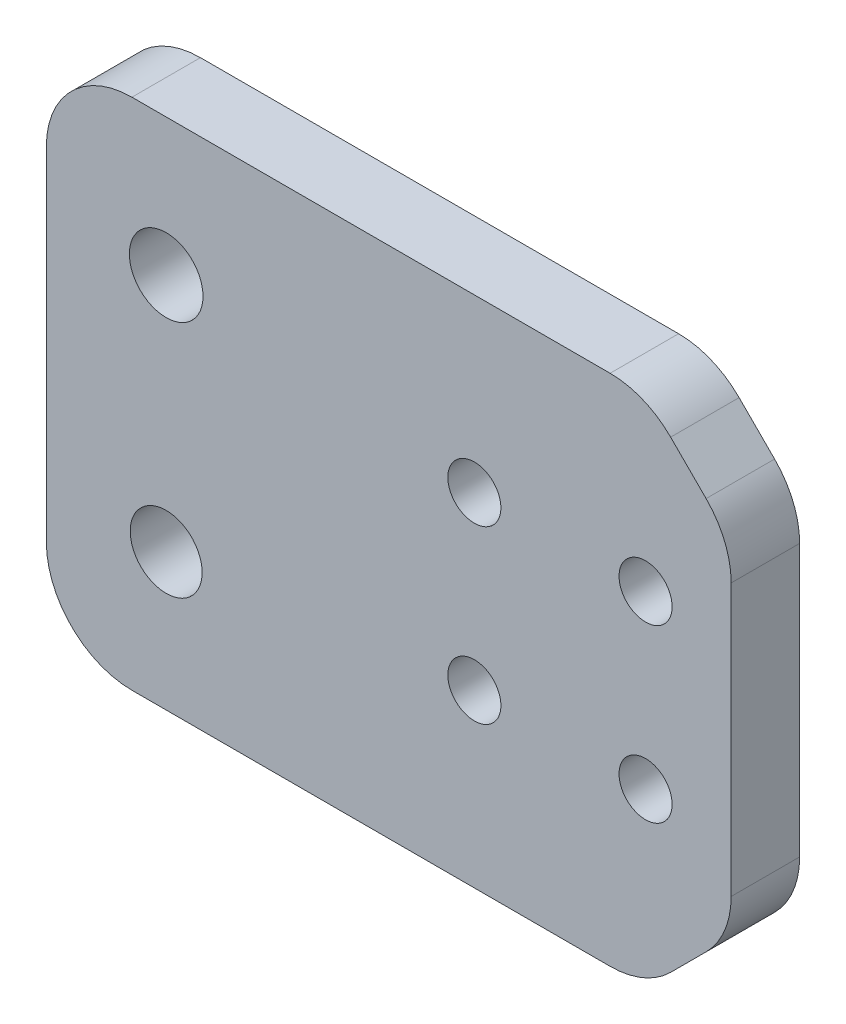
ISO-10303-21;
HEADER;
FILE_DESCRIPTION(('STEP AP214'),'2;1');
FILE_NAME('part.step','',(''),(''),'','','');
FILE_SCHEMA(('AUTOMOTIVE_DESIGN { 1 0 10303 214 1 1 1 1 }'));
ENDSEC;
DATA;
#1=APPLICATION_CONTEXT('core data for automotive mechanical design processes');
#2=APPLICATION_PROTOCOL_DEFINITION('international standard','automotive_design',2000,#1);
#3=PRODUCT_CONTEXT('',#1,'mechanical');
#4=PRODUCT('Part','Part','',(#3));
#5=PRODUCT_RELATED_PRODUCT_CATEGORY('part','',(#4));
#6=PRODUCT_DEFINITION_FORMATION('','',#4);
#7=PRODUCT_DEFINITION_CONTEXT('part definition',#1,'design');
#8=PRODUCT_DEFINITION('design','',#6,#7);
#9=PRODUCT_DEFINITION_SHAPE('','',#8);
#10=(LENGTH_UNIT() NAMED_UNIT(*) SI_UNIT(.MILLI.,.METRE.));
#11=(NAMED_UNIT(*) PLANE_ANGLE_UNIT() SI_UNIT($,.RADIAN.));
#12=(NAMED_UNIT(*) SI_UNIT($,.STERADIAN.) SOLID_ANGLE_UNIT());
#13=UNCERTAINTY_MEASURE_WITH_UNIT(LENGTH_MEASURE(1.E-05),#10,'distance_accuracy_value','');
#14=(GEOMETRIC_REPRESENTATION_CONTEXT(3) GLOBAL_UNCERTAINTY_ASSIGNED_CONTEXT((#13)) GLOBAL_UNIT_ASSIGNED_CONTEXT((#10,
#11,#12)) REPRESENTATION_CONTEXT('',''));
#15=CARTESIAN_POINT('',(0.,0.,0.));
#16=DIRECTION('',(0.,0.,1.));
#17=DIRECTION('',(1.,0.,0.));
#18=AXIS2_PLACEMENT_3D('',#15,#16,#17);
#19=CARTESIAN_POINT('',(0.,0.,4.));
#20=DIRECTION('',(0.,0.,-1.));
#21=DIRECTION('',(-1.,0.,0.));
#22=AXIS2_PLACEMENT_3D('',#19,#20,#21);
#23=PLANE('',#22);
#24=DIRECTION('',(1.,0.,0.));
#25=VECTOR('',#24,1.);
#26=CARTESIAN_POINT('',(0.,0.,4.));
#27=LINE('',#26,#25);
#28=CARTESIAN_POINT('',(5.,0.,4.));
#29=VERTEX_POINT('',#28);
#30=CARTESIAN_POINT('',(32.9289321881345,0.,4.));
#31=VERTEX_POINT('',#30);
#32=EDGE_CURVE('E150',#29,#31,#27,.T.);
#33=ORIENTED_EDGE('',*,*,#32,.T.);
#34=CARTESIAN_POINT('',(32.9289321881345,5.,4.));
#35=DIRECTION('',(0.,0.,-1.));
#36=DIRECTION('',(-1.,0.,0.));
#37=AXIS2_PLACEMENT_3D('',#34,#35,#36);
#38=CIRCLE('',#37,5.);
#39=CARTESIAN_POINT('',(36.4644660940672,1.46446609406726,4.));
#40=VERTEX_POINT('',#39);
#41=EDGE_CURVE('E193',#31,#40,#38,.F.);
#42=ORIENTED_EDGE('',*,*,#41,.T.);
#43=DIRECTION('',(-0.707106781186549,-0.707106781186547,0.));
#44=VECTOR('',#43,1.);
#45=CARTESIAN_POINT('',(40.,5.,4.));
#46=LINE('',#45,#44);
#47=CARTESIAN_POINT('',(38.5355339059327,3.53553390593274,4.));
#48=VERTEX_POINT('',#47);
#49=EDGE_CURVE('E152',#40,#48,#46,.F.);
#50=ORIENTED_EDGE('',*,*,#49,.T.);
#51=CARTESIAN_POINT('',(35.,7.07106781186549,4.));
#52=DIRECTION('',(0.,0.,-1.));
#53=DIRECTION('',(-1.,0.,0.));
#54=AXIS2_PLACEMENT_3D('',#51,#52,#53);
#55=CIRCLE('',#54,5.);
#56=CARTESIAN_POINT('',(40.,7.07106781186549,4.));
#57=VERTEX_POINT('',#56);
#58=EDGE_CURVE('E191',#48,#57,#55,.F.);
#59=ORIENTED_EDGE('',*,*,#58,.T.);
#60=DIRECTION('',(0.,1.,0.));
#61=VECTOR('',#60,1.);
#62=CARTESIAN_POINT('',(40.,0.,4.));
#63=LINE('',#62,#61);
#64=CARTESIAN_POINT('',(40.,22.9289321881345,4.));
#65=VERTEX_POINT('',#64);
#66=EDGE_CURVE('E236',#57,#65,#63,.T.);
#67=ORIENTED_EDGE('',*,*,#66,.T.);
#68=CARTESIAN_POINT('',(35.,22.9289321881345,4.));
#69=DIRECTION('',(0.,0.,-1.));
#70=DIRECTION('',(-1.,0.,0.));
#71=AXIS2_PLACEMENT_3D('',#68,#69,#70);
#72=CIRCLE('',#71,5.);
#73=CARTESIAN_POINT('',(38.5355339059328,26.4644660940672,4.));
#74=VERTEX_POINT('',#73);
#75=EDGE_CURVE('E189',#65,#74,#72,.F.);
#76=ORIENTED_EDGE('',*,*,#75,.T.);
#77=DIRECTION('',(0.707106781186546,-0.70710678118655,0.));
#78=VECTOR('',#77,1.);
#79=CARTESIAN_POINT('',(35.,30.,4.));
#80=LINE('',#79,#78);
#81=CARTESIAN_POINT('',(36.4644660940673,28.5355339059327,4.));
#82=VERTEX_POINT('',#81);
#83=EDGE_CURVE('E177',#74,#82,#80,.F.);
#84=ORIENTED_EDGE('',*,*,#83,.T.);
#85=CARTESIAN_POINT('',(32.9289321881345,25.,4.));
#86=DIRECTION('',(0.,0.,-1.));
#87=DIRECTION('',(-1.,0.,0.));
#88=AXIS2_PLACEMENT_3D('',#85,#86,#87);
#89=CIRCLE('',#88,5.);
#90=CARTESIAN_POINT('',(32.9289321881345,30.,4.));
#91=VERTEX_POINT('',#90);
#92=EDGE_CURVE('E187',#82,#91,#89,.F.);
#93=ORIENTED_EDGE('',*,*,#92,.T.);
#94=DIRECTION('',(-1.,0.,0.));
#95=VECTOR('',#94,1.);
#96=CARTESIAN_POINT('',(0.,30.,4.));
#97=LINE('',#96,#95);
#98=CARTESIAN_POINT('',(5.,30.,4.));
#99=VERTEX_POINT('',#98);
#100=EDGE_CURVE('E175',#91,#99,#97,.T.);
#101=ORIENTED_EDGE('',*,*,#100,.T.);
#102=CARTESIAN_POINT('',(5.,25.,4.));
#103=DIRECTION('',(0.,0.,-1.));
#104=DIRECTION('',(-1.,0.,0.));
#105=AXIS2_PLACEMENT_3D('',#102,#103,#104);
#106=CIRCLE('',#105,5.);
#107=CARTESIAN_POINT('',(0.,25.,4.));
#108=VERTEX_POINT('',#107);
#109=EDGE_CURVE('E183',#99,#108,#106,.F.);
#110=ORIENTED_EDGE('',*,*,#109,.T.);
#111=DIRECTION('',(0.,-1.,0.));
#112=VECTOR('',#111,1.);
#113=CARTESIAN_POINT('',(0.,0.,4.));
#114=LINE('',#113,#112);
#115=CARTESIAN_POINT('',(0.,5.,4.));
#116=VERTEX_POINT('',#115);
#117=EDGE_CURVE('E171',#108,#116,#114,.T.);
#118=ORIENTED_EDGE('',*,*,#117,.T.);
#119=CARTESIAN_POINT('',(5.,5.,4.));
#120=DIRECTION('',(0.,0.,-1.));
#121=DIRECTION('',(-1.,0.,0.));
#122=AXIS2_PLACEMENT_3D('',#119,#120,#121);
#123=CIRCLE('',#122,5.);
#124=EDGE_CURVE('E185',#116,#29,#123,.F.);
#125=ORIENTED_EDGE('',*,*,#124,.T.);
#126=EDGE_LOOP('',(#33,#42,#50,#59,#67,#76,#84,#93,#101,#110,#118,#125));
#127=FACE_BOUND('',#126,.T.);
#128=CARTESIAN_POINT('',(7.,22.,4.));
#129=DIRECTION('',(0.,0.,1.));
#130=DIRECTION('',(1.,0.,0.));
#131=AXIS2_PLACEMENT_3D('',#128,#129,#130);
#132=CIRCLE('',#131,2.14999999999999);
#133=CARTESIAN_POINT('',(9.14999999999999,22.,4.));
#134=VERTEX_POINT('',#133);
#135=EDGE_CURVE('E165',#134,#134,#132,.T.);
#136=ORIENTED_EDGE('',*,*,#135,.F.);
#137=EDGE_LOOP('',(#136));
#138=FACE_BOUND('',#137,.T.);
#139=CARTESIAN_POINT('',(7.,8.00000000000005,4.));
#140=DIRECTION('',(0.,0.,1.));
#141=DIRECTION('',(1.,0.,0.));
#142=AXIS2_PLACEMENT_3D('',#139,#140,#141);
#143=CIRCLE('',#142,2.09999999999999);
#144=CARTESIAN_POINT('',(9.09999999999999,8.00000000000005,4.));
#145=VERTEX_POINT('',#144);
#146=EDGE_CURVE('E245',#145,#145,#143,.T.);
#147=ORIENTED_EDGE('',*,*,#146,.F.);
#148=EDGE_LOOP('',(#147));
#149=FACE_BOUND('',#148,.T.);
#150=CARTESIAN_POINT('',(35.,20.,4.));
#151=DIRECTION('',(0.,0.,1.));
#152=DIRECTION('',(1.,0.,0.));
#153=AXIS2_PLACEMENT_3D('',#150,#151,#152);
#154=CIRCLE('',#153,1.54999999999999);
#155=CARTESIAN_POINT('',(36.55,20.,4.));
#156=VERTEX_POINT('',#155);
#157=EDGE_CURVE('E251',#156,#156,#154,.T.);
#158=ORIENTED_EDGE('',*,*,#157,.F.);
#159=EDGE_LOOP('',(#158));
#160=FACE_BOUND('',#159,.T.);
#161=CARTESIAN_POINT('',(25.,19.9999999999999,4.));
#162=DIRECTION('',(0.,0.,1.));
#163=DIRECTION('',(1.,0.,0.));
#164=AXIS2_PLACEMENT_3D('',#161,#162,#163);
#165=CIRCLE('',#164,1.54999999999999);
#166=CARTESIAN_POINT('',(26.55,19.9999999999999,4.));
#167=VERTEX_POINT('',#166);
#168=EDGE_CURVE('E257',#167,#167,#165,.T.);
#169=ORIENTED_EDGE('',*,*,#168,.F.);
#170=EDGE_LOOP('',(#169));
#171=FACE_BOUND('',#170,.T.);
#172=CARTESIAN_POINT('',(25.0000000000001,9.99999999999993,4.));
#173=DIRECTION('',(0.,0.,1.));
#174=DIRECTION('',(1.,0.,0.));
#175=AXIS2_PLACEMENT_3D('',#172,#173,#174);
#176=CIRCLE('',#175,1.54999999999999);
#177=CARTESIAN_POINT('',(26.5500000000001,9.99999999999993,4.));
#178=VERTEX_POINT('',#177);
#179=EDGE_CURVE('E263',#178,#178,#176,.T.);
#180=ORIENTED_EDGE('',*,*,#179,.F.);
#181=EDGE_LOOP('',(#180));
#182=FACE_BOUND('',#181,.T.);
#183=CARTESIAN_POINT('',(35.0000000000001,10.,4.));
#184=DIRECTION('',(0.,0.,1.));
#185=DIRECTION('',(1.,0.,0.));
#186=AXIS2_PLACEMENT_3D('',#183,#184,#185);
#187=CIRCLE('',#186,1.54999999999999);
#188=CARTESIAN_POINT('',(36.5500000000001,10.,4.));
#189=VERTEX_POINT('',#188);
#190=EDGE_CURVE('E269',#189,#189,#187,.T.);
#191=ORIENTED_EDGE('',*,*,#190,.F.);
#192=EDGE_LOOP('',(#191));
#193=FACE_BOUND('',#192,.T.);
#194=ADVANCED_FACE('F43',(#127,#138,#149,#160,#171,#182,#193),#23,.F.);
#195=CARTESIAN_POINT('',(0.,0.,0.));
#196=DIRECTION('',(0.,0.,-1.));
#197=DIRECTION('',(-1.,0.,0.));
#198=AXIS2_PLACEMENT_3D('',#195,#196,#197);
#199=PLANE('',#198);
#200=CARTESIAN_POINT('',(25.0000000000001,9.99999999999993,0.));
#201=DIRECTION('',(0.,0.,1.));
#202=DIRECTION('',(1.,0.,0.));
#203=AXIS2_PLACEMENT_3D('',#200,#201,#202);
#204=CIRCLE('',#203,1.54999999999999);
#205=CARTESIAN_POINT('',(26.5500000000001,9.99999999999993,0.));
#206=VERTEX_POINT('',#205);
#207=EDGE_CURVE('E266',#206,#206,#204,.T.);
#208=ORIENTED_EDGE('',*,*,#207,.T.);
#209=EDGE_LOOP('',(#208));
#210=FACE_BOUND('',#209,.T.);
#211=CARTESIAN_POINT('',(35.,20.,0.));
#212=DIRECTION('',(0.,0.,1.));
#213=DIRECTION('',(1.,0.,0.));
#214=AXIS2_PLACEMENT_3D('',#211,#212,#213);
#215=CIRCLE('',#214,1.54999999999999);
#216=CARTESIAN_POINT('',(36.55,20.,0.));
#217=VERTEX_POINT('',#216);
#218=EDGE_CURVE('E254',#217,#217,#215,.T.);
#219=ORIENTED_EDGE('',*,*,#218,.T.);
#220=EDGE_LOOP('',(#219));
#221=FACE_BOUND('',#220,.T.);
#222=CARTESIAN_POINT('',(7.,22.,0.));
#223=DIRECTION('',(0.,0.,1.));
#224=DIRECTION('',(1.,0.,0.));
#225=AXIS2_PLACEMENT_3D('',#222,#223,#224);
#226=CIRCLE('',#225,2.14999999999999);
#227=CARTESIAN_POINT('',(9.14999999999999,22.,0.));
#228=VERTEX_POINT('',#227);
#229=EDGE_CURVE('E242',#228,#228,#226,.T.);
#230=ORIENTED_EDGE('',*,*,#229,.T.);
#231=EDGE_LOOP('',(#230));
#232=FACE_BOUND('',#231,.T.);
#233=DIRECTION('',(0.707106781186549,0.707106781186547,0.));
#234=VECTOR('',#233,1.);
#235=CARTESIAN_POINT('',(17.4999999999999,-17.5,0.));
#236=LINE('',#235,#234);
#237=CARTESIAN_POINT('',(38.5355339059327,3.53553390593274,0.));
#238=VERTEX_POINT('',#237);
#239=CARTESIAN_POINT('',(36.4644660940673,1.46446609406726,0.));
#240=VERTEX_POINT('',#239);
#241=EDGE_CURVE('E174',#238,#240,#236,.F.);
#242=ORIENTED_EDGE('',*,*,#241,.T.);
#243=CARTESIAN_POINT('',(32.9289321881345,5.,0.));
#244=DIRECTION('',(0.,0.,-1.));
#245=DIRECTION('',(-1.,0.,0.));
#246=AXIS2_PLACEMENT_3D('',#243,#244,#245);
#247=CIRCLE('',#246,5.);
#248=CARTESIAN_POINT('',(32.9289321881345,0.,0.));
#249=VERTEX_POINT('',#248);
#250=EDGE_CURVE('E158',#240,#249,#247,.T.);
#251=ORIENTED_EDGE('',*,*,#250,.T.);
#252=DIRECTION('',(1.,0.,0.));
#253=VECTOR('',#252,1.);
#254=CARTESIAN_POINT('',(0.,0.,0.));
#255=LINE('',#254,#253);
#256=CARTESIAN_POINT('',(5.,0.,0.));
#257=VERTEX_POINT('',#256);
#258=EDGE_CURVE('E147',#257,#249,#255,.T.);
#259=ORIENTED_EDGE('',*,*,#258,.F.);
#260=CARTESIAN_POINT('',(5.,5.,0.));
#261=DIRECTION('',(0.,0.,-1.));
#262=DIRECTION('',(-1.,0.,0.));
#263=AXIS2_PLACEMENT_3D('',#260,#261,#262);
#264=CIRCLE('',#263,5.);
#265=CARTESIAN_POINT('',(0.,5.,0.));
#266=VERTEX_POINT('',#265);
#267=EDGE_CURVE('E132',#257,#266,#264,.T.);
#268=ORIENTED_EDGE('',*,*,#267,.T.);
#269=DIRECTION('',(0.,-1.,0.));
#270=VECTOR('',#269,1.);
#271=CARTESIAN_POINT('',(0.,0.,0.));
#272=LINE('',#271,#270);
#273=CARTESIAN_POINT('',(0.,25.,0.));
#274=VERTEX_POINT('',#273);
#275=EDGE_CURVE('E160',#274,#266,#272,.T.);
#276=ORIENTED_EDGE('',*,*,#275,.F.);
#277=CARTESIAN_POINT('',(5.,25.,0.));
#278=DIRECTION('',(0.,0.,-1.));
#279=DIRECTION('',(-1.,0.,0.));
#280=AXIS2_PLACEMENT_3D('',#277,#278,#279);
#281=CIRCLE('',#280,5.);
#282=CARTESIAN_POINT('',(5.,30.,0.));
#283=VERTEX_POINT('',#282);
#284=EDGE_CURVE('E140',#274,#283,#281,.T.);
#285=ORIENTED_EDGE('',*,*,#284,.T.);
#286=DIRECTION('',(-1.,0.,0.));
#287=VECTOR('',#286,1.);
#288=CARTESIAN_POINT('',(0.,30.,0.));
#289=LINE('',#288,#287);
#290=CARTESIAN_POINT('',(32.9289321881345,30.,0.));
#291=VERTEX_POINT('',#290);
#292=EDGE_CURVE('E163',#291,#283,#289,.T.);
#293=ORIENTED_EDGE('',*,*,#292,.F.);
#294=CARTESIAN_POINT('',(32.9289321881345,25.,0.));
#295=DIRECTION('',(0.,0.,-1.));
#296=DIRECTION('',(-1.,0.,0.));
#297=AXIS2_PLACEMENT_3D('',#294,#295,#296);
#298=CIRCLE('',#297,5.);
#299=CARTESIAN_POINT('',(36.4644660940673,28.5355339059327,0.));
#300=VERTEX_POINT('',#299);
#301=EDGE_CURVE('E65',#291,#300,#298,.T.);
#302=ORIENTED_EDGE('',*,*,#301,.T.);
#303=DIRECTION('',(-0.707106781186546,0.70710678118655,0.));
#304=VECTOR('',#303,1.);
#305=CARTESIAN_POINT('',(32.5000000000001,32.4999999999999,0.));
#306=LINE('',#305,#304);
#307=CARTESIAN_POINT('',(38.5355339059328,26.4644660940672,0.));
#308=VERTEX_POINT('',#307);
#309=EDGE_CURVE('E172',#300,#308,#306,.F.);
#310=ORIENTED_EDGE('',*,*,#309,.T.);
#311=CARTESIAN_POINT('',(35.,22.9289321881345,0.));
#312=DIRECTION('',(0.,0.,-1.));
#313=DIRECTION('',(-1.,0.,0.));
#314=AXIS2_PLACEMENT_3D('',#311,#312,#313);
#315=CIRCLE('',#314,5.);
#316=CARTESIAN_POINT('',(40.,22.9289321881345,0.));
#317=VERTEX_POINT('',#316);
#318=EDGE_CURVE('E201',#308,#317,#315,.T.);
#319=ORIENTED_EDGE('',*,*,#318,.T.);
#320=DIRECTION('',(0.,1.,0.));
#321=VECTOR('',#320,1.);
#322=CARTESIAN_POINT('',(40.,0.,0.));
#323=LINE('',#322,#321);
#324=CARTESIAN_POINT('',(40.,7.07106781186549,0.));
#325=VERTEX_POINT('',#324);
#326=EDGE_CURVE('E159',#325,#317,#323,.T.);
#327=ORIENTED_EDGE('',*,*,#326,.F.);
#328=CARTESIAN_POINT('',(35.,7.07106781186549,0.));
#329=DIRECTION('',(0.,0.,-1.));
#330=DIRECTION('',(-1.,0.,0.));
#331=AXIS2_PLACEMENT_3D('',#328,#329,#330);
#332=CIRCLE('',#331,5.);
#333=EDGE_CURVE('E203',#325,#238,#332,.T.);
#334=ORIENTED_EDGE('',*,*,#333,.T.);
#335=EDGE_LOOP('',(#242,#251,#259,#268,#276,#285,#293,#302,#310,#319,#327,#334));
#336=FACE_BOUND('',#335,.T.);
#337=CARTESIAN_POINT('',(7.,8.00000000000005,0.));
#338=DIRECTION('',(0.,0.,1.));
#339=DIRECTION('',(1.,0.,0.));
#340=AXIS2_PLACEMENT_3D('',#337,#338,#339);
#341=CIRCLE('',#340,2.09999999999999);
#342=CARTESIAN_POINT('',(9.09999999999999,8.00000000000005,0.));
#343=VERTEX_POINT('',#342);
#344=EDGE_CURVE('E248',#343,#343,#341,.T.);
#345=ORIENTED_EDGE('',*,*,#344,.T.);
#346=EDGE_LOOP('',(#345));
#347=FACE_BOUND('',#346,.T.);
#348=CARTESIAN_POINT('',(25.,19.9999999999999,0.));
#349=DIRECTION('',(0.,0.,1.));
#350=DIRECTION('',(1.,0.,0.));
#351=AXIS2_PLACEMENT_3D('',#348,#349,#350);
#352=CIRCLE('',#351,1.54999999999999);
#353=CARTESIAN_POINT('',(26.55,19.9999999999999,0.));
#354=VERTEX_POINT('',#353);
#355=EDGE_CURVE('E260',#354,#354,#352,.T.);
#356=ORIENTED_EDGE('',*,*,#355,.T.);
#357=EDGE_LOOP('',(#356));
#358=FACE_BOUND('',#357,.T.);
#359=CARTESIAN_POINT('',(35.0000000000001,10.,0.));
#360=DIRECTION('',(0.,0.,1.));
#361=DIRECTION('',(1.,0.,0.));
#362=AXIS2_PLACEMENT_3D('',#359,#360,#361);
#363=CIRCLE('',#362,1.54999999999999);
#364=CARTESIAN_POINT('',(36.5500000000001,10.,0.));
#365=VERTEX_POINT('',#364);
#366=EDGE_CURVE('E272',#365,#365,#363,.T.);
#367=ORIENTED_EDGE('',*,*,#366,.T.);
#368=EDGE_LOOP('',(#367));
#369=FACE_BOUND('',#368,.T.);
#370=ADVANCED_FACE('F155',(#210,#221,#232,#336,#347,#358,#369),#199,.T.);
#371=CARTESIAN_POINT('',(0.,0.,4.));
#372=DIRECTION('',(1.,0.,0.));
#373=DIRECTION('',(0.,0.,-1.));
#374=AXIS2_PLACEMENT_3D('',#371,#372,#373);
#375=PLANE('',#374);
#376=ORIENTED_EDGE('',*,*,#275,.T.);
#377=DIRECTION('',(0.,0.,-1.));
#378=VECTOR('',#377,1.);
#379=CARTESIAN_POINT('',(0.,5.,4.));
#380=LINE('',#379,#378);
#381=EDGE_CURVE('E11',#266,#116,#380,.F.);
#382=ORIENTED_EDGE('',*,*,#381,.T.);
#383=ORIENTED_EDGE('',*,*,#117,.F.);
#384=DIRECTION('',(0.,0.,-1.));
#385=VECTOR('',#384,1.);
#386=CARTESIAN_POINT('',(0.,25.,4.));
#387=LINE('',#386,#385);
#388=EDGE_CURVE('E51',#108,#274,#387,.T.);
#389=ORIENTED_EDGE('',*,*,#388,.T.);
#390=EDGE_LOOP('',(#376,#382,#383,#389));
#391=FACE_BOUND('',#390,.T.);
#392=ADVANCED_FACE('F223',(#391),#375,.F.);
#393=CARTESIAN_POINT('',(0.,0.,4.));
#394=DIRECTION('',(0.,1.,0.));
#395=DIRECTION('',(0.,0.,1.));
#396=AXIS2_PLACEMENT_3D('',#393,#394,#395);
#397=PLANE('',#396);
#398=ORIENTED_EDGE('',*,*,#258,.T.);
#399=DIRECTION('',(0.,0.,-1.));
#400=VECTOR('',#399,1.);
#401=CARTESIAN_POINT('',(32.9289321881345,0.,4.));
#402=LINE('',#401,#400);
#403=EDGE_CURVE('E151',#249,#31,#402,.F.);
#404=ORIENTED_EDGE('',*,*,#403,.T.);
#405=ORIENTED_EDGE('',*,*,#32,.F.);
#406=DIRECTION('',(0.,0.,-1.));
#407=VECTOR('',#406,1.);
#408=CARTESIAN_POINT('',(5.,0.,4.));
#409=LINE('',#408,#407);
#410=EDGE_CURVE('E136',#29,#257,#409,.T.);
#411=ORIENTED_EDGE('',*,*,#410,.T.);
#412=EDGE_LOOP('',(#398,#404,#405,#411));
#413=FACE_BOUND('',#412,.T.);
#414=ADVANCED_FACE('F145',(#413),#397,.F.);
#415=CARTESIAN_POINT('',(40.,0.,4.));
#416=DIRECTION('',(-1.,0.,0.));
#417=DIRECTION('',(0.,0.,1.));
#418=AXIS2_PLACEMENT_3D('',#415,#416,#417);
#419=PLANE('',#418);
#420=ORIENTED_EDGE('',*,*,#66,.F.);
#421=DIRECTION('',(0.,0.,1.));
#422=VECTOR('',#421,1.);
#423=CARTESIAN_POINT('',(40.,7.07106781186549,0.));
#424=LINE('',#423,#422);
#425=EDGE_CURVE('E209',#57,#325,#424,.F.);
#426=ORIENTED_EDGE('',*,*,#425,.T.);
#427=ORIENTED_EDGE('',*,*,#326,.T.);
#428=DIRECTION('',(0.,0.,-1.));
#429=VECTOR('',#428,1.);
#430=CARTESIAN_POINT('',(40.,22.9289321881345,4.));
#431=LINE('',#430,#429);
#432=EDGE_CURVE('E206',#317,#65,#431,.F.);
#433=ORIENTED_EDGE('',*,*,#432,.T.);
#434=EDGE_LOOP('',(#420,#426,#427,#433));
#435=FACE_BOUND('',#434,.T.);
#436=ADVANCED_FACE('F295',(#435),#419,.F.);
#437=CARTESIAN_POINT('',(0.,30.,4.));
#438=DIRECTION('',(0.,-1.,0.));
#439=DIRECTION('',(0.,0.,-1.));
#440=AXIS2_PLACEMENT_3D('',#437,#438,#439);
#441=PLANE('',#440);
#442=ORIENTED_EDGE('',*,*,#100,.F.);
#443=DIRECTION('',(0.,0.,1.));
#444=VECTOR('',#443,1.);
#445=CARTESIAN_POINT('',(32.9289321881345,30.,0.));
#446=LINE('',#445,#444);
#447=EDGE_CURVE('E217',#91,#291,#446,.F.);
#448=ORIENTED_EDGE('',*,*,#447,.T.);
#449=ORIENTED_EDGE('',*,*,#292,.T.);
#450=DIRECTION('',(0.,0.,-1.));
#451=VECTOR('',#450,1.);
#452=CARTESIAN_POINT('',(5.,30.,4.));
#453=LINE('',#452,#451);
#454=EDGE_CURVE('E215',#283,#99,#453,.F.);
#455=ORIENTED_EDGE('',*,*,#454,.T.);
#456=EDGE_LOOP('',(#442,#448,#449,#455));
#457=FACE_BOUND('',#456,.T.);
#458=ADVANCED_FACE('F230',(#457),#441,.F.);
#459=CARTESIAN_POINT('',(7.,22.,4.));
#460=DIRECTION('',(0.,0.,-1.));
#461=DIRECTION('',(-1.,0.,0.));
#462=AXIS2_PLACEMENT_3D('',#459,#460,#461);
#463=CYLINDRICAL_SURFACE('',#462,2.14999999999999);
#464=ORIENTED_EDGE('',*,*,#135,.T.);
#465=EDGE_LOOP('',(#464));
#466=FACE_BOUND('',#465,.T.);
#467=ORIENTED_EDGE('',*,*,#229,.F.);
#468=EDGE_LOOP('',(#467));
#469=FACE_BOUND('',#468,.T.);
#470=ADVANCED_FACE('F290',(#466,#469),#463,.F.);
#471=CARTESIAN_POINT('',(7.,8.00000000000005,4.));
#472=DIRECTION('',(0.,0.,-1.));
#473=DIRECTION('',(-1.,0.,0.));
#474=AXIS2_PLACEMENT_3D('',#471,#472,#473);
#475=CYLINDRICAL_SURFACE('',#474,2.09999999999999);
#476=ORIENTED_EDGE('',*,*,#146,.T.);
#477=EDGE_LOOP('',(#476));
#478=FACE_BOUND('',#477,.T.);
#479=ORIENTED_EDGE('',*,*,#344,.F.);
#480=EDGE_LOOP('',(#479));
#481=FACE_BOUND('',#480,.T.);
#482=ADVANCED_FACE('F415',(#478,#481),#475,.F.);
#483=CARTESIAN_POINT('',(35.,20.,4.));
#484=DIRECTION('',(0.,0.,-1.));
#485=DIRECTION('',(-1.,0.,0.));
#486=AXIS2_PLACEMENT_3D('',#483,#484,#485);
#487=CYLINDRICAL_SURFACE('',#486,1.54999999999999);
#488=ORIENTED_EDGE('',*,*,#157,.T.);
#489=EDGE_LOOP('',(#488));
#490=FACE_BOUND('',#489,.T.);
#491=ORIENTED_EDGE('',*,*,#218,.F.);
#492=EDGE_LOOP('',(#491));
#493=FACE_BOUND('',#492,.T.);
#494=ADVANCED_FACE('F405',(#490,#493),#487,.F.);
#495=CARTESIAN_POINT('',(25.,19.9999999999999,4.));
#496=DIRECTION('',(0.,0.,-1.));
#497=DIRECTION('',(-1.,0.,0.));
#498=AXIS2_PLACEMENT_3D('',#495,#496,#497);
#499=CYLINDRICAL_SURFACE('',#498,1.54999999999999);
#500=ORIENTED_EDGE('',*,*,#168,.T.);
#501=EDGE_LOOP('',(#500));
#502=FACE_BOUND('',#501,.T.);
#503=ORIENTED_EDGE('',*,*,#355,.F.);
#504=EDGE_LOOP('',(#503));
#505=FACE_BOUND('',#504,.T.);
#506=ADVANCED_FACE('F395',(#502,#505),#499,.F.);
#507=CARTESIAN_POINT('',(25.0000000000001,9.99999999999993,4.));
#508=DIRECTION('',(0.,0.,-1.));
#509=DIRECTION('',(-1.,0.,0.));
#510=AXIS2_PLACEMENT_3D('',#507,#508,#509);
#511=CYLINDRICAL_SURFACE('',#510,1.54999999999999);
#512=ORIENTED_EDGE('',*,*,#179,.T.);
#513=EDGE_LOOP('',(#512));
#514=FACE_BOUND('',#513,.T.);
#515=ORIENTED_EDGE('',*,*,#207,.F.);
#516=EDGE_LOOP('',(#515));
#517=FACE_BOUND('',#516,.T.);
#518=ADVANCED_FACE('F386',(#514,#517),#511,.F.);
#519=CARTESIAN_POINT('',(35.0000000000001,10.,4.));
#520=DIRECTION('',(0.,0.,-1.));
#521=DIRECTION('',(-1.,0.,0.));
#522=AXIS2_PLACEMENT_3D('',#519,#520,#521);
#523=CYLINDRICAL_SURFACE('',#522,1.54999999999999);
#524=ORIENTED_EDGE('',*,*,#190,.T.);
#525=EDGE_LOOP('',(#524));
#526=FACE_BOUND('',#525,.T.);
#527=ORIENTED_EDGE('',*,*,#366,.F.);
#528=EDGE_LOOP('',(#527));
#529=FACE_BOUND('',#528,.T.);
#530=ADVANCED_FACE('F278',(#526,#529),#523,.F.);
#531=CARTESIAN_POINT('',(40.,5.,4.));
#532=DIRECTION('',(-0.707106781186547,0.707106781186549,0.));
#533=DIRECTION('',(0.,0.,-1.));
#534=AXIS2_PLACEMENT_3D('',#531,#532,#533);
#535=PLANE('',#534);
#536=ORIENTED_EDGE('',*,*,#49,.F.);
#537=DIRECTION('',(0.,0.,1.));
#538=VECTOR('',#537,1.);
#539=CARTESIAN_POINT('',(36.4644660940672,1.46446609406726,0.));
#540=LINE('',#539,#538);
#541=EDGE_CURVE('E197',#40,#240,#540,.F.);
#542=ORIENTED_EDGE('',*,*,#541,.T.);
#543=ORIENTED_EDGE('',*,*,#241,.F.);
#544=DIRECTION('',(0.,0.,-1.));
#545=VECTOR('',#544,1.);
#546=CARTESIAN_POINT('',(38.5355339059327,3.53553390593274,4.));
#547=LINE('',#546,#545);
#548=EDGE_CURVE('E195',#238,#48,#547,.F.);
#549=ORIENTED_EDGE('',*,*,#548,.T.);
#550=EDGE_LOOP('',(#536,#542,#543,#549));
#551=FACE_BOUND('',#550,.T.);
#552=ADVANCED_FACE('F304',(#551),#535,.F.);
#553=CARTESIAN_POINT('',(35.,30.,4.));
#554=DIRECTION('',(-0.70710678118655,-0.707106781186546,0.));
#555=DIRECTION('',(0.,0.,-1.));
#556=AXIS2_PLACEMENT_3D('',#553,#554,#555);
#557=PLANE('',#556);
#558=ORIENTED_EDGE('',*,*,#83,.F.);
#559=DIRECTION('',(0.,0.,1.));
#560=VECTOR('',#559,1.);
#561=CARTESIAN_POINT('',(38.5355339059328,26.4644660940672,0.));
#562=LINE('',#561,#560);
#563=EDGE_CURVE('E58',#74,#308,#562,.F.);
#564=ORIENTED_EDGE('',*,*,#563,.T.);
#565=ORIENTED_EDGE('',*,*,#309,.F.);
#566=DIRECTION('',(0.,0.,-1.));
#567=VECTOR('',#566,1.);
#568=CARTESIAN_POINT('',(36.4644660940673,28.5355339059327,4.));
#569=LINE('',#568,#567);
#570=EDGE_CURVE('E212',#300,#82,#569,.F.);
#571=ORIENTED_EDGE('',*,*,#570,.T.);
#572=EDGE_LOOP('',(#558,#564,#565,#571));
#573=FACE_BOUND('',#572,.T.);
#574=ADVANCED_FACE('F310',(#573),#557,.F.);
#575=CARTESIAN_POINT('',(32.9289321881345,5.,4.));
#576=DIRECTION('',(0.,0.,1.));
#577=DIRECTION('',(1.,0.,0.));
#578=AXIS2_PLACEMENT_3D('',#575,#576,#577);
#579=CYLINDRICAL_SURFACE('',#578,5.);
#580=ORIENTED_EDGE('',*,*,#250,.F.);
#581=ORIENTED_EDGE('',*,*,#541,.F.);
#582=ORIENTED_EDGE('',*,*,#41,.F.);
#583=ORIENTED_EDGE('',*,*,#403,.F.);
#584=EDGE_LOOP('',(#580,#581,#582,#583));
#585=FACE_BOUND('',#584,.T.);
#586=ADVANCED_FACE('F316',(#585),#579,.T.);
#587=CARTESIAN_POINT('',(35.,7.07106781186549,4.));
#588=DIRECTION('',(0.,0.,-1.));
#589=DIRECTION('',(-1.,0.,0.));
#590=AXIS2_PLACEMENT_3D('',#587,#588,#589);
#591=CYLINDRICAL_SURFACE('',#590,5.);
#592=ORIENTED_EDGE('',*,*,#58,.F.);
#593=ORIENTED_EDGE('',*,*,#548,.F.);
#594=ORIENTED_EDGE('',*,*,#333,.F.);
#595=ORIENTED_EDGE('',*,*,#425,.F.);
#596=EDGE_LOOP('',(#592,#593,#594,#595));
#597=FACE_BOUND('',#596,.T.);
#598=ADVANCED_FACE('F319',(#597),#591,.T.);
#599=CARTESIAN_POINT('',(35.,22.9289321881345,4.));
#600=DIRECTION('',(0.,0.,1.));
#601=DIRECTION('',(1.,0.,0.));
#602=AXIS2_PLACEMENT_3D('',#599,#600,#601);
#603=CYLINDRICAL_SURFACE('',#602,5.);
#604=ORIENTED_EDGE('',*,*,#318,.F.);
#605=ORIENTED_EDGE('',*,*,#563,.F.);
#606=ORIENTED_EDGE('',*,*,#75,.F.);
#607=ORIENTED_EDGE('',*,*,#432,.F.);
#608=EDGE_LOOP('',(#604,#605,#606,#607));
#609=FACE_BOUND('',#608,.T.);
#610=ADVANCED_FACE('F323',(#609),#603,.T.);
#611=CARTESIAN_POINT('',(32.9289321881345,25.,4.));
#612=DIRECTION('',(0.,0.,-1.));
#613=DIRECTION('',(-1.,0.,0.));
#614=AXIS2_PLACEMENT_3D('',#611,#612,#613);
#615=CYLINDRICAL_SURFACE('',#614,5.);
#616=ORIENTED_EDGE('',*,*,#92,.F.);
#617=ORIENTED_EDGE('',*,*,#570,.F.);
#618=ORIENTED_EDGE('',*,*,#301,.F.);
#619=ORIENTED_EDGE('',*,*,#447,.F.);
#620=EDGE_LOOP('',(#616,#617,#618,#619));
#621=FACE_BOUND('',#620,.T.);
#622=ADVANCED_FACE('F327',(#621),#615,.T.);
#623=CARTESIAN_POINT('',(5.,5.,4.));
#624=DIRECTION('',(0.,0.,-1.));
#625=DIRECTION('',(-1.,0.,0.));
#626=AXIS2_PLACEMENT_3D('',#623,#624,#625);
#627=CYLINDRICAL_SURFACE('',#626,5.);
#628=ORIENTED_EDGE('',*,*,#124,.F.);
#629=ORIENTED_EDGE('',*,*,#381,.F.);
#630=ORIENTED_EDGE('',*,*,#267,.F.);
#631=ORIENTED_EDGE('',*,*,#410,.F.);
#632=EDGE_LOOP('',(#628,#629,#630,#631));
#633=FACE_BOUND('',#632,.T.);
#634=ADVANCED_FACE('F135',(#633),#627,.T.);
#635=CARTESIAN_POINT('',(5.,25.,4.));
#636=DIRECTION('',(0.,0.,-1.));
#637=DIRECTION('',(-1.,0.,0.));
#638=AXIS2_PLACEMENT_3D('',#635,#636,#637);
#639=CYLINDRICAL_SURFACE('',#638,5.);
#640=ORIENTED_EDGE('',*,*,#109,.F.);
#641=ORIENTED_EDGE('',*,*,#454,.F.);
#642=ORIENTED_EDGE('',*,*,#284,.F.);
#643=ORIENTED_EDGE('',*,*,#388,.F.);
#644=EDGE_LOOP('',(#640,#641,#642,#643));
#645=FACE_BOUND('',#644,.T.);
#646=ADVANCED_FACE('F45',(#645),#639,.T.);
#647=CLOSED_SHELL('',(#194,#370,#392,#414,#436,#458,#470,#482,#494,#506,#518,#530,#552,#574,
#586,#598,#610,#622,#634,#646));
#648=MANIFOLD_SOLID_BREP('B2',#647);
#649=ADVANCED_BREP_SHAPE_REPRESENTATION('',(#18,#648),#14);
#650=SHAPE_DEFINITION_REPRESENTATION(#9,#649);
ENDSEC;
END-ISO-10303-21;
